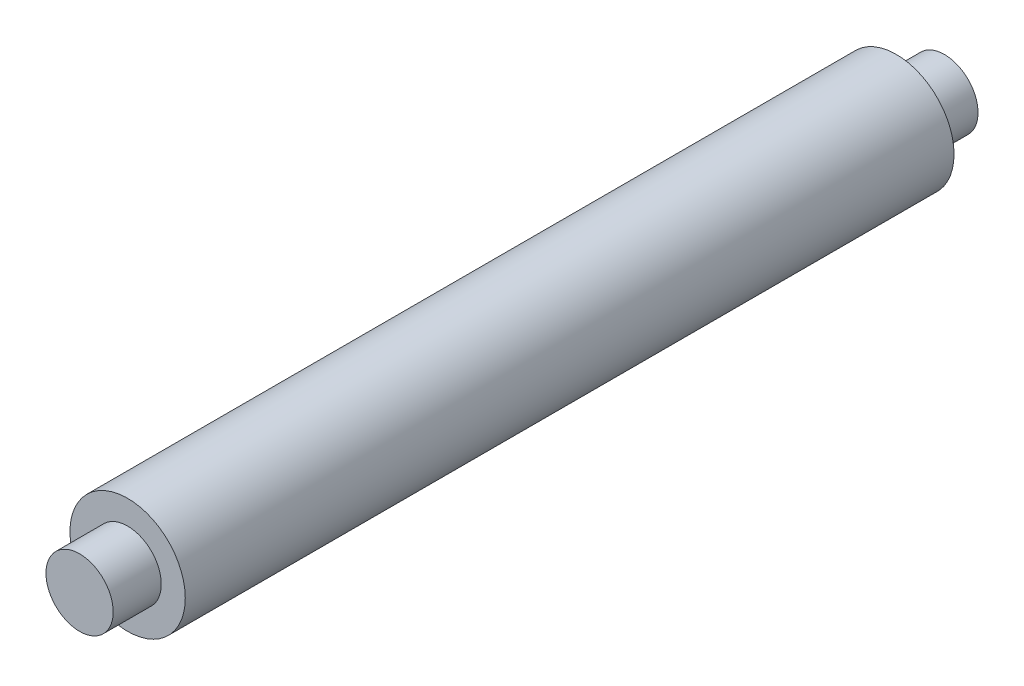
ISO-10303-21;
HEADER;
FILE_DESCRIPTION(('STEP AP214'),'2;1');
FILE_NAME('part.step','',(''),(''),'','','');
FILE_SCHEMA(('AUTOMOTIVE_DESIGN { 1 0 10303 214 1 1 1 1 }'));
ENDSEC;
DATA;
#1=APPLICATION_CONTEXT('core data for automotive mechanical design processes');
#2=APPLICATION_PROTOCOL_DEFINITION('international standard','automotive_design',2000,#1);
#3=PRODUCT_CONTEXT('',#1,'mechanical');
#4=PRODUCT('Part','Part','',(#3));
#5=PRODUCT_RELATED_PRODUCT_CATEGORY('part','',(#4));
#6=PRODUCT_DEFINITION_FORMATION('','',#4);
#7=PRODUCT_DEFINITION_CONTEXT('part definition',#1,'design');
#8=PRODUCT_DEFINITION('design','',#6,#7);
#9=PRODUCT_DEFINITION_SHAPE('','',#8);
#10=(LENGTH_UNIT() NAMED_UNIT(*) SI_UNIT(.MILLI.,.METRE.));
#11=(NAMED_UNIT(*) PLANE_ANGLE_UNIT() SI_UNIT($,.RADIAN.));
#12=(NAMED_UNIT(*) SI_UNIT($,.STERADIAN.) SOLID_ANGLE_UNIT());
#13=UNCERTAINTY_MEASURE_WITH_UNIT(LENGTH_MEASURE(1.E-05),#10,'distance_accuracy_value','');
#14=(GEOMETRIC_REPRESENTATION_CONTEXT(3) GLOBAL_UNCERTAINTY_ASSIGNED_CONTEXT((#13)) GLOBAL_UNIT_ASSIGNED_CONTEXT((#10,
#11,#12)) REPRESENTATION_CONTEXT('',''));
#15=CARTESIAN_POINT('',(0.,0.,0.));
#16=DIRECTION('',(0.,0.,1.));
#17=DIRECTION('',(1.,0.,0.));
#18=AXIS2_PLACEMENT_3D('',#15,#16,#17);
#19=CARTESIAN_POINT('',(0.,0.,320.));
#20=DIRECTION('',(0.,0.,-1.));
#21=DIRECTION('',(-1.,0.,0.));
#22=AXIS2_PLACEMENT_3D('',#19,#20,#21);
#23=CYLINDRICAL_SURFACE('',#22,24.);
#24=CARTESIAN_POINT('',(0.,0.,320.));
#25=DIRECTION('',(0.,0.,1.));
#26=DIRECTION('',(1.,0.,0.));
#27=AXIS2_PLACEMENT_3D('',#24,#25,#26);
#28=CIRCLE('',#27,24.);
#29=CARTESIAN_POINT('',(24.,0.,320.));
#30=VERTEX_POINT('',#29);
#31=EDGE_CURVE('E56',#30,#30,#28,.T.);
#32=ORIENTED_EDGE('',*,*,#31,.F.);
#33=EDGE_LOOP('',(#32));
#34=FACE_BOUND('',#33,.T.);
#35=CARTESIAN_POINT('',(0.,0.,0.));
#36=DIRECTION('',(0.,0.,1.));
#37=DIRECTION('',(1.,0.,0.));
#38=AXIS2_PLACEMENT_3D('',#35,#36,#37);
#39=CIRCLE('',#38,24.);
#40=CARTESIAN_POINT('',(24.,0.,0.));
#41=VERTEX_POINT('',#40);
#42=EDGE_CURVE('E47',#41,#41,#39,.T.);
#43=ORIENTED_EDGE('',*,*,#42,.T.);
#44=EDGE_LOOP('',(#43));
#45=FACE_BOUND('',#44,.T.);
#46=ADVANCED_FACE('F44',(#34,#45),#23,.T.);
#47=CARTESIAN_POINT('',(0.,0.,320.));
#48=DIRECTION('',(0.,0.,1.));
#49=DIRECTION('',(1.,0.,0.));
#50=AXIS2_PLACEMENT_3D('',#47,#48,#49);
#51=PLANE('',#50);
#52=CARTESIAN_POINT('',(0.,0.,320.));
#53=DIRECTION('',(0.,0.,1.));
#54=DIRECTION('',(1.,0.,0.));
#55=AXIS2_PLACEMENT_3D('',#52,#53,#54);
#56=CIRCLE('',#55,14.);
#57=CARTESIAN_POINT('',(14.,0.,320.));
#58=VERTEX_POINT('',#57);
#59=EDGE_CURVE('E12',#58,#58,#56,.T.);
#60=ORIENTED_EDGE('',*,*,#59,.F.);
#61=EDGE_LOOP('',(#60));
#62=FACE_BOUND('',#61,.T.);
#63=ORIENTED_EDGE('',*,*,#31,.T.);
#64=EDGE_LOOP('',(#63));
#65=FACE_BOUND('',#64,.T.);
#66=ADVANCED_FACE('F73',(#62,#65),#51,.T.);
#67=CARTESIAN_POINT('',(0.,0.,0.));
#68=DIRECTION('',(0.,0.,1.));
#69=DIRECTION('',(1.,0.,0.));
#70=AXIS2_PLACEMENT_3D('',#67,#68,#69);
#71=PLANE('',#70);
#72=CARTESIAN_POINT('',(0.,0.,0.));
#73=DIRECTION('',(0.,0.,-1.));
#74=DIRECTION('',(-1.,0.,0.));
#75=AXIS2_PLACEMENT_3D('',#72,#73,#74);
#76=CIRCLE('',#75,14.);
#77=CARTESIAN_POINT('',(-14.,0.,0.));
#78=VERTEX_POINT('',#77);
#79=EDGE_CURVE('E51',#78,#78,#76,.T.);
#80=ORIENTED_EDGE('',*,*,#79,.F.);
#81=EDGE_LOOP('',(#80));
#82=FACE_BOUND('',#81,.T.);
#83=ORIENTED_EDGE('',*,*,#42,.F.);
#84=EDGE_LOOP('',(#83));
#85=FACE_BOUND('',#84,.T.);
#86=ADVANCED_FACE('F70',(#82,#85),#71,.F.);
#87=CARTESIAN_POINT('',(0.,0.,-20.));
#88=DIRECTION('',(0.,0.,1.));
#89=DIRECTION('',(1.,0.,0.));
#90=AXIS2_PLACEMENT_3D('',#87,#88,#89);
#91=CYLINDRICAL_SURFACE('',#90,14.);
#92=CARTESIAN_POINT('',(0.,0.,-20.));
#93=DIRECTION('',(0.,0.,-1.));
#94=DIRECTION('',(-1.,0.,0.));
#95=AXIS2_PLACEMENT_3D('',#92,#93,#94);
#96=CIRCLE('',#95,14.);
#97=CARTESIAN_POINT('',(-14.,0.,-20.));
#98=VERTEX_POINT('',#97);
#99=EDGE_CURVE('E61',#98,#98,#96,.T.);
#100=ORIENTED_EDGE('',*,*,#99,.F.);
#101=EDGE_LOOP('',(#100));
#102=FACE_BOUND('',#101,.T.);
#103=ORIENTED_EDGE('',*,*,#79,.T.);
#104=EDGE_LOOP('',(#103));
#105=FACE_BOUND('',#104,.T.);
#106=ADVANCED_FACE('F72',(#102,#105),#91,.T.);
#107=CARTESIAN_POINT('',(0.,0.,-20.));
#108=DIRECTION('',(0.,0.,-1.));
#109=DIRECTION('',(-1.,0.,0.));
#110=AXIS2_PLACEMENT_3D('',#107,#108,#109);
#111=PLANE('',#110);
#112=ORIENTED_EDGE('',*,*,#99,.T.);
#113=EDGE_LOOP('',(#112));
#114=FACE_BOUND('',#113,.T.);
#115=ADVANCED_FACE('F79',(#114),#111,.T.);
#116=CARTESIAN_POINT('',(0.,0.,340.));
#117=DIRECTION('',(0.,0.,-1.));
#118=DIRECTION('',(-1.,0.,0.));
#119=AXIS2_PLACEMENT_3D('',#116,#117,#118);
#120=CYLINDRICAL_SURFACE('',#119,14.);
#121=CARTESIAN_POINT('',(0.,0.,340.));
#122=DIRECTION('',(0.,0.,1.));
#123=DIRECTION('',(1.,0.,0.));
#124=AXIS2_PLACEMENT_3D('',#121,#122,#123);
#125=CIRCLE('',#124,14.);
#126=CARTESIAN_POINT('',(14.,0.,340.));
#127=VERTEX_POINT('',#126);
#128=EDGE_CURVE('E60',#127,#127,#125,.T.);
#129=ORIENTED_EDGE('',*,*,#128,.F.);
#130=EDGE_LOOP('',(#129));
#131=FACE_BOUND('',#130,.T.);
#132=ORIENTED_EDGE('',*,*,#59,.T.);
#133=EDGE_LOOP('',(#132));
#134=FACE_BOUND('',#133,.T.);
#135=ADVANCED_FACE('F104',(#131,#134),#120,.T.);
#136=CARTESIAN_POINT('',(0.,0.,340.));
#137=DIRECTION('',(0.,0.,1.));
#138=DIRECTION('',(1.,0.,0.));
#139=AXIS2_PLACEMENT_3D('',#136,#137,#138);
#140=PLANE('',#139);
#141=ORIENTED_EDGE('',*,*,#128,.T.);
#142=EDGE_LOOP('',(#141));
#143=FACE_BOUND('',#142,.T.);
#144=ADVANCED_FACE('F109',(#143),#140,.T.);
#145=CLOSED_SHELL('',(#46,#66,#86,#106,#115,#135,#144));
#146=MANIFOLD_SOLID_BREP('B2',#145);
#147=ADVANCED_BREP_SHAPE_REPRESENTATION('',(#18,#146),#14);
#148=SHAPE_DEFINITION_REPRESENTATION(#9,#147);
ENDSEC;
END-ISO-10303-21;
